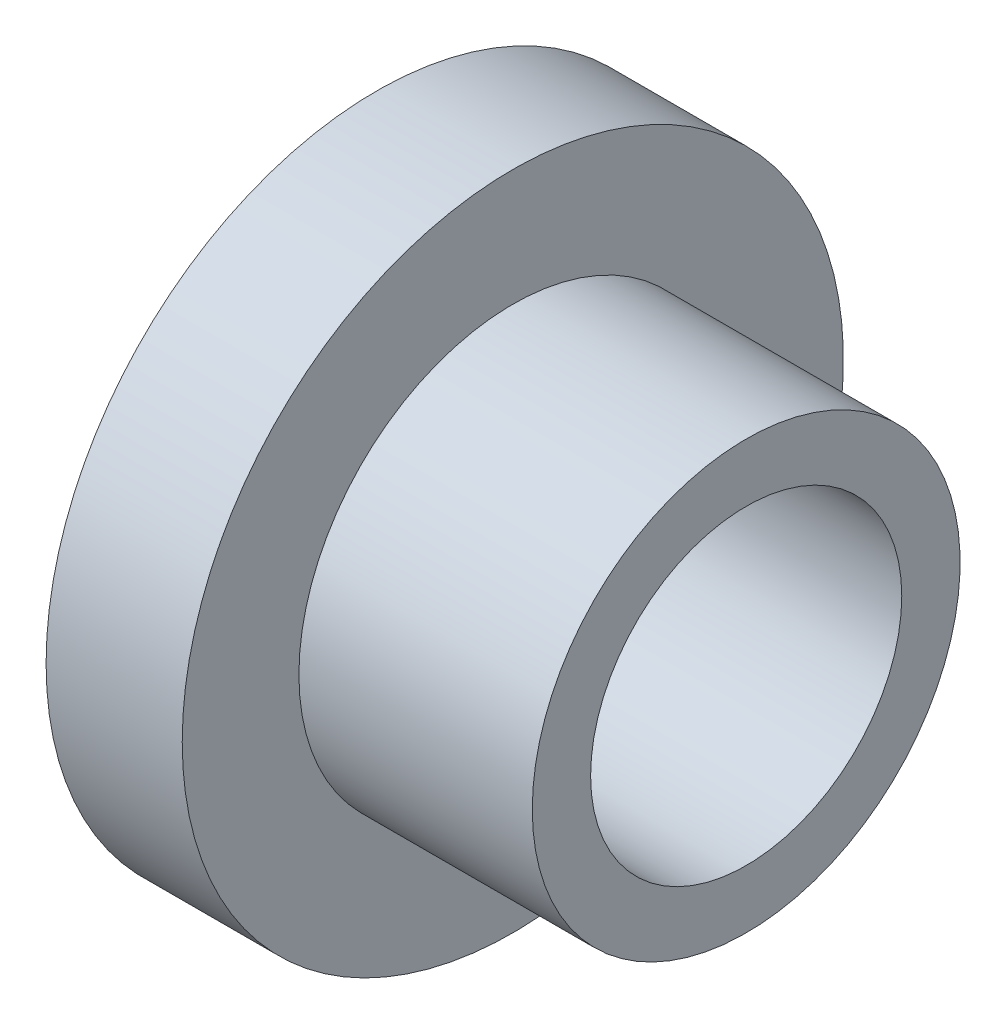
ISO-10303-21;
HEADER;
FILE_DESCRIPTION(('STEP AP214'),'2;1');
FILE_NAME('part.step','',(''),(''),'','','');
FILE_SCHEMA(('AUTOMOTIVE_DESIGN { 1 0 10303 214 1 1 1 1 }'));
ENDSEC;
DATA;
#1=APPLICATION_CONTEXT('core data for automotive mechanical design processes');
#2=APPLICATION_PROTOCOL_DEFINITION('international standard','automotive_design',2000,#1);
#3=PRODUCT_CONTEXT('',#1,'mechanical');
#4=PRODUCT('Part','Part','',(#3));
#5=PRODUCT_RELATED_PRODUCT_CATEGORY('part','',(#4));
#6=PRODUCT_DEFINITION_FORMATION('','',#4);
#7=PRODUCT_DEFINITION_CONTEXT('part definition',#1,'design');
#8=PRODUCT_DEFINITION('design','',#6,#7);
#9=PRODUCT_DEFINITION_SHAPE('','',#8);
#10=(LENGTH_UNIT() NAMED_UNIT(*) SI_UNIT(.MILLI.,.METRE.));
#11=(NAMED_UNIT(*) PLANE_ANGLE_UNIT() SI_UNIT($,.RADIAN.));
#12=(NAMED_UNIT(*) SI_UNIT($,.STERADIAN.) SOLID_ANGLE_UNIT());
#13=UNCERTAINTY_MEASURE_WITH_UNIT(LENGTH_MEASURE(1.E-05),#10,'distance_accuracy_value','');
#14=(GEOMETRIC_REPRESENTATION_CONTEXT(3) GLOBAL_UNCERTAINTY_ASSIGNED_CONTEXT((#13)) GLOBAL_UNIT_ASSIGNED_CONTEXT((#10,
#11,#12)) REPRESENTATION_CONTEXT('',''));
#15=CARTESIAN_POINT('',(0.,0.,0.));
#16=DIRECTION('',(0.,0.,1.));
#17=DIRECTION('',(1.,0.,0.));
#18=AXIS2_PLACEMENT_3D('',#15,#16,#17);
#19=CARTESIAN_POINT('',(0.,0.,0.));
#20=DIRECTION('',(-1.,0.,0.));
#21=DIRECTION('',(0.,0.,1.));
#22=AXIS2_PLACEMENT_3D('',#19,#20,#21);
#23=CYLINDRICAL_SURFACE('',#22,7.99999999999999);
#24=CARTESIAN_POINT('',(19.,0.,0.));
#25=DIRECTION('',(-1.,0.,0.));
#26=DIRECTION('',(0.,0.,1.));
#27=AXIS2_PLACEMENT_3D('',#24,#25,#26);
#28=CIRCLE('',#27,7.99999999999999);
#29=CARTESIAN_POINT('',(19.,0.,8.));
#30=VERTEX_POINT('',#29);
#31=EDGE_CURVE('E52',#30,#30,#28,.T.);
#32=ORIENTED_EDGE('',*,*,#31,.F.);
#33=EDGE_LOOP('',(#32));
#34=FACE_BOUND('',#33,.T.);
#35=CARTESIAN_POINT('',(0.,0.,0.));
#36=DIRECTION('',(-1.,0.,0.));
#37=DIRECTION('',(0.,0.,1.));
#38=AXIS2_PLACEMENT_3D('',#35,#36,#37);
#39=CIRCLE('',#38,7.99999999999999);
#40=CARTESIAN_POINT('',(0.,0.,8.));
#41=VERTEX_POINT('',#40);
#42=EDGE_CURVE('E10',#41,#41,#39,.T.);
#43=ORIENTED_EDGE('',*,*,#42,.T.);
#44=EDGE_LOOP('',(#43));
#45=FACE_BOUND('',#44,.T.);
#46=ADVANCED_FACE('F30',(#34,#45),#23,.F.);
#47=CARTESIAN_POINT('',(0.,8.,0.));
#48=DIRECTION('',(1.,0.,0.));
#49=DIRECTION('',(0.,0.,-1.));
#50=AXIS2_PLACEMENT_3D('',#47,#48,#49);
#51=PLANE('',#50);
#52=ORIENTED_EDGE('',*,*,#42,.F.);
#53=EDGE_LOOP('',(#52));
#54=FACE_BOUND('',#53,.T.);
#55=CARTESIAN_POINT('',(0.,0.,0.));
#56=DIRECTION('',(-1.,0.,0.));
#57=DIRECTION('',(0.,0.,1.));
#58=AXIS2_PLACEMENT_3D('',#55,#56,#57);
#59=CIRCLE('',#58,17.);
#60=CARTESIAN_POINT('',(0.,0.,17.));
#61=VERTEX_POINT('',#60);
#62=EDGE_CURVE('E36',#61,#61,#59,.T.);
#63=ORIENTED_EDGE('',*,*,#62,.T.);
#64=EDGE_LOOP('',(#63));
#65=FACE_BOUND('',#64,.T.);
#66=ADVANCED_FACE('F59',(#54,#65),#51,.F.);
#67=CARTESIAN_POINT('',(0.,0.,0.));
#68=DIRECTION('',(-1.,0.,0.));
#69=DIRECTION('',(0.,0.,1.));
#70=AXIS2_PLACEMENT_3D('',#67,#68,#69);
#71=CYLINDRICAL_SURFACE('',#70,17.);
#72=ORIENTED_EDGE('',*,*,#62,.F.);
#73=EDGE_LOOP('',(#72));
#74=FACE_BOUND('',#73,.T.);
#75=CARTESIAN_POINT('',(6.99999999999998,0.,0.));
#76=DIRECTION('',(-1.,0.,0.));
#77=DIRECTION('',(0.,0.,1.));
#78=AXIS2_PLACEMENT_3D('',#75,#76,#77);
#79=CIRCLE('',#78,17.);
#80=CARTESIAN_POINT('',(6.99999999999998,0.,17.));
#81=VERTEX_POINT('',#80);
#82=EDGE_CURVE('E40',#81,#81,#79,.T.);
#83=ORIENTED_EDGE('',*,*,#82,.T.);
#84=EDGE_LOOP('',(#83));
#85=FACE_BOUND('',#84,.T.);
#86=ADVANCED_FACE('F63',(#74,#85),#71,.T.);
#87=CARTESIAN_POINT('',(6.99999999999998,17.,0.));
#88=DIRECTION('',(-1.,0.,0.));
#89=DIRECTION('',(0.,0.,1.));
#90=AXIS2_PLACEMENT_3D('',#87,#88,#89);
#91=PLANE('',#90);
#92=ORIENTED_EDGE('',*,*,#82,.F.);
#93=EDGE_LOOP('',(#92));
#94=FACE_BOUND('',#93,.T.);
#95=CARTESIAN_POINT('',(6.99999999999998,0.,0.));
#96=DIRECTION('',(-1.,0.,0.));
#97=DIRECTION('',(0.,0.,1.));
#98=AXIS2_PLACEMENT_3D('',#95,#96,#97);
#99=CIRCLE('',#98,11.);
#100=CARTESIAN_POINT('',(6.99999999999998,0.,11.));
#101=VERTEX_POINT('',#100);
#102=EDGE_CURVE('E44',#101,#101,#99,.T.);
#103=ORIENTED_EDGE('',*,*,#102,.T.);
#104=EDGE_LOOP('',(#103));
#105=FACE_BOUND('',#104,.T.);
#106=ADVANCED_FACE('F68',(#94,#105),#91,.F.);
#107=CARTESIAN_POINT('',(0.,0.,0.));
#108=DIRECTION('',(-1.,0.,0.));
#109=DIRECTION('',(0.,0.,1.));
#110=AXIS2_PLACEMENT_3D('',#107,#108,#109);
#111=CYLINDRICAL_SURFACE('',#110,11.);
#112=ORIENTED_EDGE('',*,*,#102,.F.);
#113=EDGE_LOOP('',(#112));
#114=FACE_BOUND('',#113,.T.);
#115=CARTESIAN_POINT('',(19.,0.,0.));
#116=DIRECTION('',(-1.,0.,0.));
#117=DIRECTION('',(0.,0.,1.));
#118=AXIS2_PLACEMENT_3D('',#115,#116,#117);
#119=CIRCLE('',#118,11.);
#120=CARTESIAN_POINT('',(19.,0.,11.));
#121=VERTEX_POINT('',#120);
#122=EDGE_CURVE('E49',#121,#121,#119,.T.);
#123=ORIENTED_EDGE('',*,*,#122,.T.);
#124=EDGE_LOOP('',(#123));
#125=FACE_BOUND('',#124,.T.);
#126=ADVANCED_FACE('F74',(#114,#125),#111,.T.);
#127=CARTESIAN_POINT('',(19.,11.,0.));
#128=DIRECTION('',(-1.,0.,0.));
#129=DIRECTION('',(0.,0.,1.));
#130=AXIS2_PLACEMENT_3D('',#127,#128,#129);
#131=PLANE('',#130);
#132=ORIENTED_EDGE('',*,*,#122,.F.);
#133=EDGE_LOOP('',(#132));
#134=FACE_BOUND('',#133,.T.);
#135=ORIENTED_EDGE('',*,*,#31,.T.);
#136=EDGE_LOOP('',(#135));
#137=FACE_BOUND('',#136,.T.);
#138=ADVANCED_FACE('F56',(#134,#137),#131,.F.);
#139=CLOSED_SHELL('',(#46,#66,#86,#106,#126,#138));
#140=MANIFOLD_SOLID_BREP('B2',#139);
#141=ADVANCED_BREP_SHAPE_REPRESENTATION('',(#18,#140),#14);
#142=SHAPE_DEFINITION_REPRESENTATION(#9,#141);
ENDSEC;
END-ISO-10303-21;
